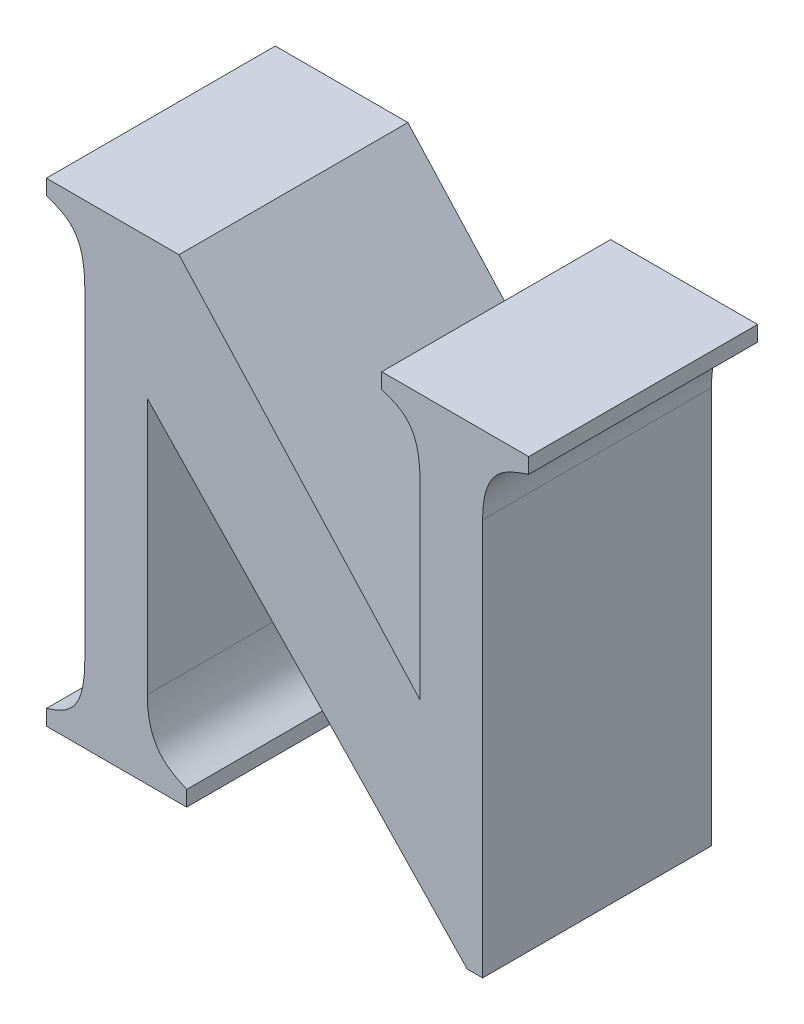
ISO-10303-21;
HEADER;
FILE_DESCRIPTION(('STEP AP214'),'2;1');
FILE_NAME('part.step','',(''),(''),'','','');
FILE_SCHEMA(('AUTOMOTIVE_DESIGN { 1 0 10303 214 1 1 1 1 }'));
ENDSEC;
DATA;
#1=APPLICATION_CONTEXT('core data for automotive mechanical design processes');
#2=APPLICATION_PROTOCOL_DEFINITION('international standard','automotive_design',2000,#1);
#3=PRODUCT_CONTEXT('',#1,'mechanical');
#4=PRODUCT('Part','Part','',(#3));
#5=PRODUCT_RELATED_PRODUCT_CATEGORY('part','',(#4));
#6=PRODUCT_DEFINITION_FORMATION('','',#4);
#7=PRODUCT_DEFINITION_CONTEXT('part definition',#1,'design');
#8=PRODUCT_DEFINITION('design','',#6,#7);
#9=PRODUCT_DEFINITION_SHAPE('','',#8);
#10=(LENGTH_UNIT() NAMED_UNIT(*) SI_UNIT(.MILLI.,.METRE.));
#11=(NAMED_UNIT(*) PLANE_ANGLE_UNIT() SI_UNIT($,.RADIAN.));
#12=(NAMED_UNIT(*) SI_UNIT($,.STERADIAN.) SOLID_ANGLE_UNIT());
#13=UNCERTAINTY_MEASURE_WITH_UNIT(LENGTH_MEASURE(1.E-05),#10,'distance_accuracy_value','');
#14=(GEOMETRIC_REPRESENTATION_CONTEXT(3) GLOBAL_UNCERTAINTY_ASSIGNED_CONTEXT((#13)) GLOBAL_UNIT_ASSIGNED_CONTEXT((#10,
#11,#12)) REPRESENTATION_CONTEXT('',''));
#15=CARTESIAN_POINT('',(0.,0.,0.));
#16=DIRECTION('',(0.,0.,1.));
#17=DIRECTION('',(1.,0.,0.));
#18=AXIS2_PLACEMENT_3D('',#15,#16,#17);
#19=CARTESIAN_POINT('',(1.131361356651,-0.46057454398,0.));
#20=DIRECTION('',(1.,0.,0.));
#21=DIRECTION('',(0.,1.,0.));
#22=AXIS2_PLACEMENT_3D('',#19,#20,#21);
#23=PLANE('',#22);
#24=DIRECTION('',(0.,-1.,0.));
#25=VECTOR('',#24,1.);
#26=CARTESIAN_POINT('',(1.131361356651,-0.28723157278345,0.));
#27=LINE('',#26,#25);
#28=CARTESIAN_POINT('',(1.131361356651,-0.28723157278345,0.));
#29=VERTEX_POINT('',#28);
#30=CARTESIAN_POINT('',(1.131361356651,-0.46057454398,0.));
#31=VERTEX_POINT('',#30);
#32=EDGE_CURVE('E11',#29,#31,#27,.T.);
#33=ORIENTED_EDGE('',*,*,#32,.F.);
#34=DIRECTION('',(0.,0.,1.));
#35=VECTOR('',#34,1.);
#36=CARTESIAN_POINT('',(1.131361356651,-0.28723157278345,0.));
#37=LINE('',#36,#35);
#38=CARTESIAN_POINT('',(1.131361356651,-0.28723157278345,0.1));
#39=VERTEX_POINT('',#38);
#40=EDGE_CURVE('E24',#29,#39,#37,.T.);
#41=ORIENTED_EDGE('',*,*,#40,.T.);
#42=DIRECTION('',(0.,1.,0.));
#43=VECTOR('',#42,1.);
#44=CARTESIAN_POINT('',(1.131361356651,-0.28723157278345,0.1));
#45=LINE('',#44,#43);
#46=CARTESIAN_POINT('',(1.131361356651,-0.46057454398,0.1));
#47=VERTEX_POINT('',#46);
#48=EDGE_CURVE('E172',#47,#39,#45,.T.);
#49=ORIENTED_EDGE('',*,*,#48,.F.);
#50=DIRECTION('',(0.,0.,1.));
#51=VECTOR('',#50,1.);
#52=CARTESIAN_POINT('',(1.131361356651,-0.46057454398,0.));
#53=LINE('',#52,#51);
#54=EDGE_CURVE('E359',#31,#47,#53,.T.);
#55=ORIENTED_EDGE('',*,*,#54,.F.);
#56=EDGE_LOOP('',(#33,#41,#49,#55));
#57=FACE_BOUND('',#56,.T.);
#58=ADVANCED_FACE('F17',(#57),#23,.T.);
#59=CARTESIAN_POINT('',(1.12464608155,-0.46057454398,0.));
#60=DIRECTION('',(0.,-1.,0.));
#61=DIRECTION('',(1.,0.,0.));
#62=AXIS2_PLACEMENT_3D('',#59,#60,#61);
#63=PLANE('',#62);
#64=DIRECTION('',(-1.,0.,0.));
#65=VECTOR('',#64,1.);
#66=CARTESIAN_POINT('',(1.131361356651,-0.46057454398,0.));
#67=LINE('',#66,#65);
#68=CARTESIAN_POINT('',(1.12464608155,-0.46057454398,0.));
#69=VERTEX_POINT('',#68);
#70=EDGE_CURVE('E357',#31,#69,#67,.T.);
#71=ORIENTED_EDGE('',*,*,#70,.F.);
#72=ORIENTED_EDGE('',*,*,#54,.T.);
#73=DIRECTION('',(1.,0.,0.));
#74=VECTOR('',#73,1.);
#75=CARTESIAN_POINT('',(1.131361356651,-0.46057454398,0.1));
#76=LINE('',#75,#74);
#77=CARTESIAN_POINT('',(1.12464608155,-0.46057454398,0.1));
#78=VERTEX_POINT('',#77);
#79=EDGE_CURVE('E355',#78,#47,#76,.T.);
#80=ORIENTED_EDGE('',*,*,#79,.F.);
#81=DIRECTION('',(0.,0.,1.));
#82=VECTOR('',#81,1.);
#83=CARTESIAN_POINT('',(1.12464608155,-0.46057454398,0.));
#84=LINE('',#83,#82);
#85=EDGE_CURVE('E352',#69,#78,#84,.T.);
#86=ORIENTED_EDGE('',*,*,#85,.F.);
#87=EDGE_LOOP('',(#71,#72,#80,#86));
#88=FACE_BOUND('',#87,.T.);
#89=ADVANCED_FACE('F429',(#88),#63,.T.);
#90=CARTESIAN_POINT('',(0.984879953778,-0.314513114854,0.));
#91=DIRECTION('',(-0.722505463033565,-0.691365211654921,0.));
#92=DIRECTION('',(0.691365211654921,-0.722505463033565,0.));
#93=AXIS2_PLACEMENT_3D('',#90,#91,#92);
#94=PLANE('',#93);
#95=DIRECTION('',(-0.691365211654921,0.722505463033565,0.));
#96=VECTOR('',#95,1.);
#97=CARTESIAN_POINT('',(1.12464608155,-0.46057454398,0.));
#98=LINE('',#97,#96);
#99=CARTESIAN_POINT('',(0.984879953778,-0.314513114854,0.));
#100=VERTEX_POINT('',#99);
#101=EDGE_CURVE('E350',#69,#100,#98,.T.);
#102=ORIENTED_EDGE('',*,*,#101,.F.);
#103=ORIENTED_EDGE('',*,*,#85,.T.);
#104=DIRECTION('',(0.691365211654921,-0.722505463033565,0.));
#105=VECTOR('',#104,1.);
#106=CARTESIAN_POINT('',(1.12464608155,-0.46057454398,0.1));
#107=LINE('',#106,#105);
#108=CARTESIAN_POINT('',(0.984879953778,-0.314513114854,0.1));
#109=VERTEX_POINT('',#108);
#110=EDGE_CURVE('E347',#109,#78,#107,.T.);
#111=ORIENTED_EDGE('',*,*,#110,.F.);
#112=DIRECTION('',(0.,0.,1.));
#113=VECTOR('',#112,1.);
#114=CARTESIAN_POINT('',(0.984879953778,-0.314513114854,0.));
#115=LINE('',#114,#113);
#116=EDGE_CURVE('E344',#100,#109,#115,.T.);
#117=ORIENTED_EDGE('',*,*,#116,.F.);
#118=EDGE_LOOP('',(#102,#103,#111,#117));
#119=FACE_BOUND('',#118,.T.);
#120=ADVANCED_FACE('F425',(#119),#94,.T.);
#121=CARTESIAN_POINT('',(0.984879953778,-0.426577508445,0.));
#122=DIRECTION('',(1.,0.,0.));
#123=DIRECTION('',(0.,1.,0.));
#124=AXIS2_PLACEMENT_3D('',#121,#122,#123);
#125=PLANE('',#124);
#126=DIRECTION('',(0.,-1.,0.));
#127=VECTOR('',#126,1.);
#128=CARTESIAN_POINT('',(0.984879953778,-0.314513114854,0.));
#129=LINE('',#128,#127);
#130=CARTESIAN_POINT('',(0.984879953778,-0.426577508445,0.));
#131=VERTEX_POINT('',#130);
#132=EDGE_CURVE('E342',#100,#131,#129,.T.);
#133=ORIENTED_EDGE('',*,*,#132,.F.);
#134=ORIENTED_EDGE('',*,*,#116,.T.);
#135=DIRECTION('',(0.,1.,0.));
#136=VECTOR('',#135,1.);
#137=CARTESIAN_POINT('',(0.984879953778,-0.314513114854,0.1));
#138=LINE('',#137,#136);
#139=CARTESIAN_POINT('',(0.984879953778,-0.426577508445,0.1));
#140=VERTEX_POINT('',#139);
#141=EDGE_CURVE('E339',#140,#109,#138,.T.);
#142=ORIENTED_EDGE('',*,*,#141,.F.);
#143=DIRECTION('',(0.,0.,1.));
#144=VECTOR('',#143,1.);
#145=CARTESIAN_POINT('',(0.984879953778,-0.426577508445,0.));
#146=LINE('',#145,#144);
#147=EDGE_CURVE('E333',#131,#140,#146,.T.);
#148=ORIENTED_EDGE('',*,*,#147,.F.);
#149=EDGE_LOOP('',(#133,#134,#142,#148));
#150=FACE_BOUND('',#149,.T.);
#151=ADVANCED_FACE('F421',(#150),#125,.T.);
#152=CARTESIAN_POINT('',(1.002089113507,-0.453859050516,0.));
#153=CARTESIAN_POINT('',(1.002089113507,-0.453859050516,0.1));
#154=CARTESIAN_POINT('',(0.995373838406,-0.450501256992,0.));
#155=CARTESIAN_POINT('',(0.995373838406,-0.450501256992,0.1));
#156=CARTESIAN_POINT('',(0.984879953778001,-0.447143557053,0.));
#157=CARTESIAN_POINT('',(0.984879953778001,-0.447143557053,0.1));
#158=CARTESIAN_POINT('',(0.984879953778,-0.426577508445,0.));
#159=CARTESIAN_POINT('',(0.984879953778,-0.426577508445,0.1));
#160=B_SPLINE_SURFACE_WITH_KNOTS('',3,1,((#152,#153),(#154,#155),(#156,#157),(#158,#159)),
.UNSPECIFIED.,.F.,.F.,.F.,(4,4),(2,2),(-1.,0.),(0.,0.01),.UNSPECIFIED.);
#161=CARTESIAN_POINT('',(0.984879953778,-0.426577508445,0.));
#162=CARTESIAN_POINT('',(0.984879953778001,-0.447143557053,0.));
#163=CARTESIAN_POINT('',(0.995373838406,-0.450501256992,0.));
#164=CARTESIAN_POINT('',(1.002089113507,-0.453859050516,0.));
#165=B_SPLINE_CURVE_WITH_KNOTS('',3,(#161,#162,#163,#164),.UNSPECIFIED.,.F.,.F.,(4,4),(0.,1.),.UNSPECIFIED.);
#166=CARTESIAN_POINT('',(1.002089113507,-0.453859050516,0.));
#167=VERTEX_POINT('',#166);
#168=EDGE_CURVE('E326',#131,#167,#165,.T.);
#169=CARTESIAN_POINT('',(1.002089113507,-0.453859050516,0.1));
#170=CARTESIAN_POINT('',(0.995373838406,-0.450501256992,0.1));
#171=CARTESIAN_POINT('',(0.984879953778001,-0.447143557053,0.1));
#172=CARTESIAN_POINT('',(0.984879953778,-0.426577508445,0.1));
#173=B_SPLINE_CURVE_WITH_KNOTS('',3,(#169,#170,#171,#172),.UNSPECIFIED.,.F.,.F.,(4,4),(-1.,0.),.UNSPECIFIED.);
#174=CARTESIAN_POINT('',(1.002089113507,-0.453859050516,0.1));
#175=VERTEX_POINT('',#174);
#176=EDGE_CURVE('E321',#175,#140,#173,.T.);
#177=DIRECTION('',(0.,0.,1.));
#178=VECTOR('',#177,1.);
#179=CARTESIAN_POINT('',(1.002089113507,-0.453859050516,0.));
#180=LINE('',#179,#178);
#181=EDGE_CURVE('E318',#167,#175,#180,.T.);
#182=ORIENTED_EDGE('',*,*,#168,.F.);
#183=ORIENTED_EDGE('',*,*,#147,.T.);
#184=ORIENTED_EDGE('',*,*,#176,.F.);
#185=ORIENTED_EDGE('',*,*,#181,.F.);
#186=EDGE_LOOP('',(#182,#183,#184,#185));
#187=FACE_BOUND('',#186,.T.);
#188=ADVANCED_FACE('F417',(#187),#160,.T.);
#189=CARTESIAN_POINT('',(1.002089113507,-0.46057454398,0.));
#190=DIRECTION('',(1.,0.,0.));
#191=DIRECTION('',(0.,1.,0.));
#192=AXIS2_PLACEMENT_3D('',#189,#190,#191);
#193=PLANE('',#192);
#194=DIRECTION('',(0.,-1.,0.));
#195=VECTOR('',#194,1.);
#196=CARTESIAN_POINT('',(1.002089113507,-0.453859050516,0.));
#197=LINE('',#196,#195);
#198=CARTESIAN_POINT('',(1.002089113507,-0.46057454398,0.));
#199=VERTEX_POINT('',#198);
#200=EDGE_CURVE('E316',#167,#199,#197,.T.);
#201=ORIENTED_EDGE('',*,*,#200,.F.);
#202=ORIENTED_EDGE('',*,*,#181,.T.);
#203=DIRECTION('',(0.,1.,0.));
#204=VECTOR('',#203,1.);
#205=CARTESIAN_POINT('',(1.002089113507,-0.453859050516,0.1));
#206=LINE('',#205,#204);
#207=CARTESIAN_POINT('',(1.002089113507,-0.46057454398,0.1));
#208=VERTEX_POINT('',#207);
#209=EDGE_CURVE('E313',#208,#175,#206,.T.);
#210=ORIENTED_EDGE('',*,*,#209,.F.);
#211=DIRECTION('',(0.,0.,1.));
#212=VECTOR('',#211,1.);
#213=CARTESIAN_POINT('',(1.002089113507,-0.46057454398,0.));
#214=LINE('',#213,#212);
#215=EDGE_CURVE('E310',#199,#208,#214,.T.);
#216=ORIENTED_EDGE('',*,*,#215,.F.);
#217=EDGE_LOOP('',(#201,#202,#210,#216));
#218=FACE_BOUND('',#217,.T.);
#219=ADVANCED_FACE('F413',(#218),#193,.T.);
#220=CARTESIAN_POINT('',(0.940809381699,-0.46057454398,0.));
#221=DIRECTION('',(0.,-1.,0.));
#222=DIRECTION('',(1.,0.,0.));
#223=AXIS2_PLACEMENT_3D('',#220,#221,#222);
#224=PLANE('',#223);
#225=DIRECTION('',(-1.,0.,0.));
#226=VECTOR('',#225,1.);
#227=CARTESIAN_POINT('',(1.002089113507,-0.46057454398,0.));
#228=LINE('',#227,#226);
#229=CARTESIAN_POINT('',(0.940809381699,-0.46057454398,0.));
#230=VERTEX_POINT('',#229);
#231=EDGE_CURVE('E308',#199,#230,#228,.T.);
#232=ORIENTED_EDGE('',*,*,#231,.F.);
#233=ORIENTED_EDGE('',*,*,#215,.T.);
#234=DIRECTION('',(1.,0.,0.));
#235=VECTOR('',#234,1.);
#236=CARTESIAN_POINT('',(1.002089113507,-0.46057454398,0.1));
#237=LINE('',#236,#235);
#238=CARTESIAN_POINT('',(0.940809381699,-0.46057454398,0.1));
#239=VERTEX_POINT('',#238);
#240=EDGE_CURVE('E305',#239,#208,#237,.T.);
#241=ORIENTED_EDGE('',*,*,#240,.F.);
#242=DIRECTION('',(0.,0.,1.));
#243=VECTOR('',#242,1.);
#244=CARTESIAN_POINT('',(0.940809381699,-0.46057454398,0.));
#245=LINE('',#244,#243);
#246=EDGE_CURVE('E302',#230,#239,#245,.T.);
#247=ORIENTED_EDGE('',*,*,#246,.F.);
#248=EDGE_LOOP('',(#232,#233,#241,#247));
#249=FACE_BOUND('',#248,.T.);
#250=ADVANCED_FACE('F409',(#249),#224,.T.);
#251=CARTESIAN_POINT('',(0.940809381699,-0.453859050516,0.));
#252=DIRECTION('',(-1.,0.,0.));
#253=DIRECTION('',(0.,-1.,0.));
#254=AXIS2_PLACEMENT_3D('',#251,#252,#253);
#255=PLANE('',#254);
#256=DIRECTION('',(0.,1.,0.));
#257=VECTOR('',#256,1.);
#258=CARTESIAN_POINT('',(0.940809381699,-0.46057454398,0.));
#259=LINE('',#258,#257);
#260=CARTESIAN_POINT('',(0.940809381699,-0.453859050516,0.));
#261=VERTEX_POINT('',#260);
#262=EDGE_CURVE('E300',#230,#261,#259,.T.);
#263=ORIENTED_EDGE('',*,*,#262,.F.);
#264=ORIENTED_EDGE('',*,*,#246,.T.);
#265=DIRECTION('',(0.,-1.,0.));
#266=VECTOR('',#265,1.);
#267=CARTESIAN_POINT('',(0.940809381699,-0.46057454398,0.1));
#268=LINE('',#267,#266);
#269=CARTESIAN_POINT('',(0.940809381699,-0.453859050516,0.1));
#270=VERTEX_POINT('',#269);
#271=EDGE_CURVE('E297',#270,#239,#268,.T.);
#272=ORIENTED_EDGE('',*,*,#271,.F.);
#273=DIRECTION('',(0.,0.,1.));
#274=VECTOR('',#273,1.);
#275=CARTESIAN_POINT('',(0.940809381699,-0.453859050516,0.));
#276=LINE('',#275,#274);
#277=EDGE_CURVE('E291',#261,#270,#276,.T.);
#278=ORIENTED_EDGE('',*,*,#277,.F.);
#279=EDGE_LOOP('',(#263,#264,#272,#278));
#280=FACE_BOUND('',#279,.T.);
#281=ADVANCED_FACE('F405',(#280),#255,.T.);
#282=CARTESIAN_POINT('',(0.957598349318,-0.426577508445,0.));
#283=CARTESIAN_POINT('',(0.957598349318,-0.426577508445,0.1));
#284=CARTESIAN_POINT('',(0.957598349318001,-0.447143557053,0.));
#285=CARTESIAN_POINT('',(0.957598349318001,-0.447143557053,0.1));
#286=CARTESIAN_POINT('',(0.950883074217001,-0.450501256992,0.));
#287=CARTESIAN_POINT('',(0.950883074217001,-0.450501256992,0.1));
#288=CARTESIAN_POINT('',(0.940809381699,-0.453859050516,0.));
#289=CARTESIAN_POINT('',(0.940809381699,-0.453859050516,0.1));
#290=B_SPLINE_SURFACE_WITH_KNOTS('',3,1,((#282,#283),(#284,#285),(#286,#287),(#288,#289)),
.UNSPECIFIED.,.F.,.F.,.F.,(4,4),(2,2),(-1.,0.),(0.,0.01),.UNSPECIFIED.);
#291=CARTESIAN_POINT('',(0.940809381699,-0.453859050516,0.));
#292=CARTESIAN_POINT('',(0.950883074217001,-0.450501256992,0.));
#293=CARTESIAN_POINT('',(0.957598349318001,-0.447143557053,0.));
#294=CARTESIAN_POINT('',(0.957598349318,-0.426577508445,0.));
#295=B_SPLINE_CURVE_WITH_KNOTS('',3,(#291,#292,#293,#294),.UNSPECIFIED.,.F.,.F.,(4,4),(0.,1.),.UNSPECIFIED.);
#296=CARTESIAN_POINT('',(0.957598349318,-0.426577508445,0.));
#297=VERTEX_POINT('',#296);
#298=EDGE_CURVE('E284',#261,#297,#295,.T.);
#299=CARTESIAN_POINT('',(0.957598349318,-0.426577508445,0.1));
#300=CARTESIAN_POINT('',(0.957598349318001,-0.447143557053,0.1));
#301=CARTESIAN_POINT('',(0.950883074217001,-0.450501256992,0.1));
#302=CARTESIAN_POINT('',(0.940809381699,-0.453859050516,0.1));
#303=B_SPLINE_CURVE_WITH_KNOTS('',3,(#299,#300,#301,#302),.UNSPECIFIED.,.F.,.F.,(4,4),(-1.,0.),.UNSPECIFIED.);
#304=CARTESIAN_POINT('',(0.957598349318,-0.426577508445,0.1));
#305=VERTEX_POINT('',#304);
#306=EDGE_CURVE('E279',#305,#270,#303,.T.);
#307=DIRECTION('',(0.,0.,1.));
#308=VECTOR('',#307,1.);
#309=CARTESIAN_POINT('',(0.957598349318,-0.426577508445,0.));
#310=LINE('',#309,#308);
#311=EDGE_CURVE('E276',#297,#305,#310,.T.);
#312=ORIENTED_EDGE('',*,*,#298,.F.);
#313=ORIENTED_EDGE('',*,*,#277,.T.);
#314=ORIENTED_EDGE('',*,*,#306,.F.);
#315=ORIENTED_EDGE('',*,*,#311,.F.);
#316=EDGE_LOOP('',(#312,#313,#314,#315));
#317=FACE_BOUND('',#316,.T.);
#318=ADVANCED_FACE('F401',(#317),#290,.T.);
#319=CARTESIAN_POINT('',(0.957598349318,-0.28723157278345,0.));
#320=DIRECTION('',(-1.,0.,0.));
#321=DIRECTION('',(0.,-1.,0.));
#322=AXIS2_PLACEMENT_3D('',#319,#320,#321);
#323=PLANE('',#322);
#324=DIRECTION('',(0.,1.,0.));
#325=VECTOR('',#324,1.);
#326=CARTESIAN_POINT('',(0.957598349318,-0.426577508445,0.));
#327=LINE('',#326,#325);
#328=CARTESIAN_POINT('',(0.957598349318,-0.28723157278345,0.));
#329=VERTEX_POINT('',#328);
#330=EDGE_CURVE('E274',#297,#329,#327,.T.);
#331=ORIENTED_EDGE('',*,*,#330,.F.);
#332=ORIENTED_EDGE('',*,*,#311,.T.);
#333=DIRECTION('',(0.,-1.,0.));
#334=VECTOR('',#333,1.);
#335=CARTESIAN_POINT('',(0.957598349318,-0.426577508445,0.1));
#336=LINE('',#335,#334);
#337=CARTESIAN_POINT('',(0.957598349318,-0.28723157278345,0.1));
#338=VERTEX_POINT('',#337);
#339=EDGE_CURVE('E271',#338,#305,#336,.T.);
#340=ORIENTED_EDGE('',*,*,#339,.F.);
#341=DIRECTION('',(0.,0.,1.));
#342=VECTOR('',#341,1.);
#343=CARTESIAN_POINT('',(0.957598349318,-0.28723157278345,0.));
#344=LINE('',#343,#342);
#345=EDGE_CURVE('E265',#329,#338,#344,.T.);
#346=ORIENTED_EDGE('',*,*,#345,.F.);
#347=EDGE_LOOP('',(#331,#332,#340,#346));
#348=FACE_BOUND('',#347,.T.);
#349=ADVANCED_FACE('F397',(#348),#323,.T.);
#350=CARTESIAN_POINT('',(0.940809381699,-0.25995003071244,0.));
#351=CARTESIAN_POINT('',(0.940809381699,-0.25995003071244,0.1));
#352=CARTESIAN_POINT('',(0.950883074217,-0.26330769945751,0.));
#353=CARTESIAN_POINT('',(0.950883074217,-0.26330769945751,0.1));
#354=CARTESIAN_POINT('',(0.957598349318,-0.26666549298124,0.));
#355=CARTESIAN_POINT('',(0.957598349318,-0.26666549298124,0.1));
#356=CARTESIAN_POINT('',(0.957598349318,-0.28723157278345,0.));
#357=CARTESIAN_POINT('',(0.957598349318,-0.28723157278345,0.1));
#358=B_SPLINE_SURFACE_WITH_KNOTS('',3,1,((#350,#351),(#352,#353),(#354,#355),(#356,#357)),
.UNSPECIFIED.,.F.,.F.,.F.,(4,4),(2,2),(-1.,0.),(0.,0.01),.UNSPECIFIED.);
#359=CARTESIAN_POINT('',(0.957598349318,-0.28723157278345,0.));
#360=CARTESIAN_POINT('',(0.957598349318,-0.26666549298124,0.));
#361=CARTESIAN_POINT('',(0.950883074217,-0.26330769945751,0.));
#362=CARTESIAN_POINT('',(0.940809381699,-0.25995003071244,0.));
#363=B_SPLINE_CURVE_WITH_KNOTS('',3,(#359,#360,#361,#362),.UNSPECIFIED.,.F.,.F.,(4,4),(0.,1.),.UNSPECIFIED.);
#364=CARTESIAN_POINT('',(0.940809381699,-0.25995003071244,0.));
#365=VERTEX_POINT('',#364);
#366=EDGE_CURVE('E258',#329,#365,#363,.T.);
#367=CARTESIAN_POINT('',(0.940809381699,-0.25995003071244,0.1));
#368=CARTESIAN_POINT('',(0.950883074217,-0.26330769945751,0.1));
#369=CARTESIAN_POINT('',(0.957598349318,-0.26666549298124,0.1));
#370=CARTESIAN_POINT('',(0.957598349318,-0.28723157278345,0.1));
#371=B_SPLINE_CURVE_WITH_KNOTS('',3,(#367,#368,#369,#370),.UNSPECIFIED.,.F.,.F.,(4,4),(-1.,0.),.UNSPECIFIED.);
#372=CARTESIAN_POINT('',(0.940809381699,-0.25995003071244,0.1));
#373=VERTEX_POINT('',#372);
#374=EDGE_CURVE('E253',#373,#338,#371,.T.);
#375=DIRECTION('',(0.,0.,1.));
#376=VECTOR('',#375,1.);
#377=CARTESIAN_POINT('',(0.940809381699,-0.25995003071244,0.));
#378=LINE('',#377,#376);
#379=EDGE_CURVE('E250',#365,#373,#378,.T.);
#380=ORIENTED_EDGE('',*,*,#366,.F.);
#381=ORIENTED_EDGE('',*,*,#345,.T.);
#382=ORIENTED_EDGE('',*,*,#374,.F.);
#383=ORIENTED_EDGE('',*,*,#379,.F.);
#384=EDGE_LOOP('',(#380,#381,#382,#383));
#385=FACE_BOUND('',#384,.T.);
#386=ADVANCED_FACE('F393',(#385),#358,.T.);
#387=CARTESIAN_POINT('',(0.940809381699,-0.25323453724898,0.));
#388=DIRECTION('',(-1.,0.,0.));
#389=DIRECTION('',(0.,-1.,0.));
#390=AXIS2_PLACEMENT_3D('',#387,#388,#389);
#391=PLANE('',#390);
#392=DIRECTION('',(0.,1.,0.));
#393=VECTOR('',#392,1.);
#394=CARTESIAN_POINT('',(0.940809381699,-0.25995003071244,0.));
#395=LINE('',#394,#393);
#396=CARTESIAN_POINT('',(0.940809381699,-0.25323453724898,0.));
#397=VERTEX_POINT('',#396);
#398=EDGE_CURVE('E248',#365,#397,#395,.T.);
#399=ORIENTED_EDGE('',*,*,#398,.F.);
#400=ORIENTED_EDGE('',*,*,#379,.T.);
#401=DIRECTION('',(0.,-1.,0.));
#402=VECTOR('',#401,1.);
#403=CARTESIAN_POINT('',(0.940809381699,-0.25995003071244,0.1));
#404=LINE('',#403,#402);
#405=CARTESIAN_POINT('',(0.940809381699,-0.25323453724898,0.1));
#406=VERTEX_POINT('',#405);
#407=EDGE_CURVE('E245',#406,#373,#404,.T.);
#408=ORIENTED_EDGE('',*,*,#407,.F.);
#409=DIRECTION('',(0.,0.,1.));
#410=VECTOR('',#409,1.);
#411=CARTESIAN_POINT('',(0.940809381699,-0.25323453724898,0.));
#412=LINE('',#411,#410);
#413=EDGE_CURVE('E242',#397,#406,#412,.T.);
#414=ORIENTED_EDGE('',*,*,#413,.F.);
#415=EDGE_LOOP('',(#399,#400,#408,#414));
#416=FACE_BOUND('',#415,.T.);
#417=ADVANCED_FACE('F389',(#416),#391,.T.);
#418=CARTESIAN_POINT('',(0.99873069609,-0.25323453724898,0.));
#419=DIRECTION('',(0.,1.,0.));
#420=DIRECTION('',(-1.,0.,0.));
#421=AXIS2_PLACEMENT_3D('',#418,#419,#420);
#422=PLANE('',#421);
#423=DIRECTION('',(1.,0.,0.));
#424=VECTOR('',#423,1.);
#425=CARTESIAN_POINT('',(0.940809381699,-0.25323453724898,0.));
#426=LINE('',#425,#424);
#427=CARTESIAN_POINT('',(0.99873069609,-0.25323453724898,0.));
#428=VERTEX_POINT('',#427);
#429=EDGE_CURVE('E240',#397,#428,#426,.T.);
#430=ORIENTED_EDGE('',*,*,#429,.F.);
#431=ORIENTED_EDGE('',*,*,#413,.T.);
#432=DIRECTION('',(-1.,0.,0.));
#433=VECTOR('',#432,1.);
#434=CARTESIAN_POINT('',(0.940809381699,-0.25323453724898,0.1));
#435=LINE('',#434,#433);
#436=CARTESIAN_POINT('',(0.99873069609,-0.25323453724898,0.1));
#437=VERTEX_POINT('',#436);
#438=EDGE_CURVE('E237',#437,#406,#435,.T.);
#439=ORIENTED_EDGE('',*,*,#438,.F.);
#440=DIRECTION('',(0.,0.,1.));
#441=VECTOR('',#440,1.);
#442=CARTESIAN_POINT('',(0.99873069609,-0.25323453724898,0.));
#443=LINE('',#442,#441);
#444=EDGE_CURVE('E234',#428,#437,#443,.T.);
#445=ORIENTED_EDGE('',*,*,#444,.F.);
#446=EDGE_LOOP('',(#430,#431,#439,#445));
#447=FACE_BOUND('',#446,.T.);
#448=ADVANCED_FACE('F385',(#447),#422,.T.);
#449=CARTESIAN_POINT('',(1.104079752191,-0.369076323775,0.));
#450=DIRECTION('',(0.73981818348661,0.672806848495593,0.));
#451=DIRECTION('',(-0.672806848495593,0.73981818348661,0.));
#452=AXIS2_PLACEMENT_3D('',#449,#450,#451);
#453=PLANE('',#452);
#454=DIRECTION('',(0.672806848495593,-0.73981818348661,0.));
#455=VECTOR('',#454,1.);
#456=CARTESIAN_POINT('',(0.99873069609,-0.25323453724898,0.));
#457=LINE('',#456,#455);
#458=CARTESIAN_POINT('',(1.104079752191,-0.369076323775,0.));
#459=VERTEX_POINT('',#458);
#460=EDGE_CURVE('E232',#428,#459,#457,.T.);
#461=ORIENTED_EDGE('',*,*,#460,.F.);
#462=ORIENTED_EDGE('',*,*,#444,.T.);
#463=DIRECTION('',(-0.672806848495593,0.73981818348661,0.));
#464=VECTOR('',#463,1.);
#465=CARTESIAN_POINT('',(0.99873069609,-0.25323453724898,0.1));
#466=LINE('',#465,#464);
#467=CARTESIAN_POINT('',(1.104079752191,-0.369076323775,0.1));
#468=VERTEX_POINT('',#467);
#469=EDGE_CURVE('E229',#468,#437,#466,.T.);
#470=ORIENTED_EDGE('',*,*,#469,.F.);
#471=DIRECTION('',(0.,0.,1.));
#472=VECTOR('',#471,1.);
#473=CARTESIAN_POINT('',(1.104079752191,-0.369076323775,0.));
#474=LINE('',#473,#472);
#475=EDGE_CURVE('E226',#459,#468,#474,.T.);
#476=ORIENTED_EDGE('',*,*,#475,.F.);
#477=EDGE_LOOP('',(#461,#462,#470,#476));
#478=FACE_BOUND('',#477,.T.);
#479=ADVANCED_FACE('F381',(#478),#453,.T.);
#480=CARTESIAN_POINT('',(1.104079752191,-0.28723157278345,0.));
#481=DIRECTION('',(-1.,0.,0.));
#482=DIRECTION('',(0.,-1.,0.));
#483=AXIS2_PLACEMENT_3D('',#480,#481,#482);
#484=PLANE('',#483);
#485=DIRECTION('',(0.,1.,0.));
#486=VECTOR('',#485,1.);
#487=CARTESIAN_POINT('',(1.104079752191,-0.369076323775,0.));
#488=LINE('',#487,#486);
#489=CARTESIAN_POINT('',(1.104079752191,-0.28723157278345,0.));
#490=VERTEX_POINT('',#489);
#491=EDGE_CURVE('E224',#459,#490,#488,.T.);
#492=ORIENTED_EDGE('',*,*,#491,.F.);
#493=ORIENTED_EDGE('',*,*,#475,.T.);
#494=DIRECTION('',(0.,-1.,0.));
#495=VECTOR('',#494,1.);
#496=CARTESIAN_POINT('',(1.104079752191,-0.369076323775,0.1));
#497=LINE('',#496,#495);
#498=CARTESIAN_POINT('',(1.104079752191,-0.28723157278345,0.1));
#499=VERTEX_POINT('',#498);
#500=EDGE_CURVE('E221',#499,#468,#497,.T.);
#501=ORIENTED_EDGE('',*,*,#500,.F.);
#502=DIRECTION('',(0.,0.,1.));
#503=VECTOR('',#502,1.);
#504=CARTESIAN_POINT('',(1.104079752191,-0.28723157278345,0.));
#505=LINE('',#504,#503);
#506=EDGE_CURVE('E215',#490,#499,#505,.T.);
#507=ORIENTED_EDGE('',*,*,#506,.F.);
#508=EDGE_LOOP('',(#492,#493,#501,#507));
#509=FACE_BOUND('',#508,.T.);
#510=ADVANCED_FACE('F377',(#509),#484,.T.);
#511=CARTESIAN_POINT('',(1.087290784572,-0.25995003071244,0.));
#512=CARTESIAN_POINT('',(1.087290784572,-0.25995003071244,0.1));
#513=CARTESIAN_POINT('',(1.09736447709,-0.26330769945751,0.));
#514=CARTESIAN_POINT('',(1.09736447709,-0.26330769945751,0.1));
#515=CARTESIAN_POINT('',(1.104079752191,-0.26666549298124,0.));
#516=CARTESIAN_POINT('',(1.104079752191,-0.26666549298124,0.1));
#517=CARTESIAN_POINT('',(1.104079752191,-0.28723157278345,0.));
#518=CARTESIAN_POINT('',(1.104079752191,-0.28723157278345,0.1));
#519=B_SPLINE_SURFACE_WITH_KNOTS('',3,1,((#511,#512),(#513,#514),(#515,#516),(#517,#518)),
.UNSPECIFIED.,.F.,.F.,.F.,(4,4),(2,2),(-1.,0.),(0.,0.01),.UNSPECIFIED.);
#520=CARTESIAN_POINT('',(1.104079752191,-0.28723157278345,0.));
#521=CARTESIAN_POINT('',(1.104079752191,-0.26666549298124,0.));
#522=CARTESIAN_POINT('',(1.09736447709,-0.26330769945751,0.));
#523=CARTESIAN_POINT('',(1.087290784572,-0.25995003071244,0.));
#524=B_SPLINE_CURVE_WITH_KNOTS('',3,(#520,#521,#522,#523),.UNSPECIFIED.,.F.,.F.,(4,4),(0.,1.),.UNSPECIFIED.);
#525=CARTESIAN_POINT('',(1.087290784572,-0.25995003071244,0.));
#526=VERTEX_POINT('',#525);
#527=EDGE_CURVE('E208',#490,#526,#524,.T.);
#528=CARTESIAN_POINT('',(1.087290784572,-0.25995003071244,0.1));
#529=CARTESIAN_POINT('',(1.09736447709,-0.26330769945751,0.1));
#530=CARTESIAN_POINT('',(1.104079752191,-0.26666549298124,0.1));
#531=CARTESIAN_POINT('',(1.104079752191,-0.28723157278345,0.1));
#532=B_SPLINE_CURVE_WITH_KNOTS('',3,(#528,#529,#530,#531),.UNSPECIFIED.,.F.,.F.,(4,4),(-1.,0.),.UNSPECIFIED.);
#533=CARTESIAN_POINT('',(1.087290784572,-0.25995003071244,0.1));
#534=VERTEX_POINT('',#533);
#535=EDGE_CURVE('E203',#534,#499,#532,.T.);
#536=DIRECTION('',(0.,0.,1.));
#537=VECTOR('',#536,1.);
#538=CARTESIAN_POINT('',(1.087290784572,-0.25995003071244,0.));
#539=LINE('',#538,#537);
#540=EDGE_CURVE('E200',#526,#534,#539,.T.);
#541=ORIENTED_EDGE('',*,*,#527,.F.);
#542=ORIENTED_EDGE('',*,*,#506,.T.);
#543=ORIENTED_EDGE('',*,*,#535,.F.);
#544=ORIENTED_EDGE('',*,*,#540,.F.);
#545=EDGE_LOOP('',(#541,#542,#543,#544));
#546=FACE_BOUND('',#545,.T.);
#547=ADVANCED_FACE('F373',(#546),#519,.T.);
#548=CARTESIAN_POINT('',(1.087290784572,-0.25323453724898,0.));
#549=DIRECTION('',(-1.,0.,0.));
#550=DIRECTION('',(0.,-1.,0.));
#551=AXIS2_PLACEMENT_3D('',#548,#549,#550);
#552=PLANE('',#551);
#553=DIRECTION('',(0.,1.,0.));
#554=VECTOR('',#553,1.);
#555=CARTESIAN_POINT('',(1.087290784572,-0.25995003071244,0.));
#556=LINE('',#555,#554);
#557=CARTESIAN_POINT('',(1.087290784572,-0.25323453724898,0.));
#558=VERTEX_POINT('',#557);
#559=EDGE_CURVE('E198',#526,#558,#556,.T.);
#560=ORIENTED_EDGE('',*,*,#559,.F.);
#561=ORIENTED_EDGE('',*,*,#540,.T.);
#562=DIRECTION('',(0.,-1.,0.));
#563=VECTOR('',#562,1.);
#564=CARTESIAN_POINT('',(1.087290784572,-0.25995003071244,0.1));
#565=LINE('',#564,#563);
#566=CARTESIAN_POINT('',(1.087290784572,-0.25323453724898,0.1));
#567=VERTEX_POINT('',#566);
#568=EDGE_CURVE('E195',#567,#534,#565,.T.);
#569=ORIENTED_EDGE('',*,*,#568,.F.);
#570=DIRECTION('',(0.,0.,1.));
#571=VECTOR('',#570,1.);
#572=CARTESIAN_POINT('',(1.087290784572,-0.25323453724898,0.));
#573=LINE('',#572,#571);
#574=EDGE_CURVE('E192',#558,#567,#573,.T.);
#575=ORIENTED_EDGE('',*,*,#574,.F.);
#576=EDGE_LOOP('',(#560,#561,#569,#575));
#577=FACE_BOUND('',#576,.T.);
#578=ADVANCED_FACE('F369',(#577),#552,.T.);
#579=CARTESIAN_POINT('',(1.1515074939,-0.25323453724898,0.));
#580=DIRECTION('',(0.,1.,0.));
#581=DIRECTION('',(-1.,0.,0.));
#582=AXIS2_PLACEMENT_3D('',#579,#580,#581);
#583=PLANE('',#582);
#584=DIRECTION('',(1.,0.,0.));
#585=VECTOR('',#584,1.);
#586=CARTESIAN_POINT('',(1.087290784572,-0.25323453724898,0.));
#587=LINE('',#586,#585);
#588=CARTESIAN_POINT('',(1.1515074939,-0.25323453724898,0.));
#589=VERTEX_POINT('',#588);
#590=EDGE_CURVE('E190',#558,#589,#587,.T.);
#591=ORIENTED_EDGE('',*,*,#590,.F.);
#592=ORIENTED_EDGE('',*,*,#574,.T.);
#593=DIRECTION('',(-1.,0.,0.));
#594=VECTOR('',#593,1.);
#595=CARTESIAN_POINT('',(1.087290784572,-0.25323453724898,0.1));
#596=LINE('',#595,#594);
#597=CARTESIAN_POINT('',(1.1515074939,-0.25323453724898,0.1));
#598=VERTEX_POINT('',#597);
#599=EDGE_CURVE('E188',#598,#567,#596,.T.);
#600=ORIENTED_EDGE('',*,*,#599,.F.);
#601=DIRECTION('',(0.,0.,1.));
#602=VECTOR('',#601,1.);
#603=CARTESIAN_POINT('',(1.1515074939,-0.25323453724898,0.));
#604=LINE('',#603,#602);
#605=EDGE_CURVE('E157',#589,#598,#604,.T.);
#606=ORIENTED_EDGE('',*,*,#605,.F.);
#607=EDGE_LOOP('',(#591,#592,#600,#606));
#608=FACE_BOUND('',#607,.T.);
#609=ADVANCED_FACE('F367',(#608),#583,.T.);
#610=CARTESIAN_POINT('',(1.1515074939,-0.25995003071244,0.));
#611=DIRECTION('',(1.,0.,0.));
#612=DIRECTION('',(0.,1.,0.));
#613=AXIS2_PLACEMENT_3D('',#610,#611,#612);
#614=PLANE('',#613);
#615=DIRECTION('',(0.,-1.,0.));
#616=VECTOR('',#615,1.);
#617=CARTESIAN_POINT('',(1.1515074939,-0.25323453724898,0.));
#618=LINE('',#617,#616);
#619=CARTESIAN_POINT('',(1.1515074939,-0.25995003071244,0.));
#620=VERTEX_POINT('',#619);
#621=EDGE_CURVE('E161',#589,#620,#618,.T.);
#622=ORIENTED_EDGE('',*,*,#621,.F.);
#623=ORIENTED_EDGE('',*,*,#605,.T.);
#624=DIRECTION('',(0.,1.,0.));
#625=VECTOR('',#624,1.);
#626=CARTESIAN_POINT('',(1.1515074939,-0.25323453724898,0.1));
#627=LINE('',#626,#625);
#628=CARTESIAN_POINT('',(1.1515074939,-0.25995003071244,0.1));
#629=VERTEX_POINT('',#628);
#630=EDGE_CURVE('E150',#629,#598,#627,.T.);
#631=ORIENTED_EDGE('',*,*,#630,.F.);
#632=DIRECTION('',(0.,0.,1.));
#633=VECTOR('',#632,1.);
#634=CARTESIAN_POINT('',(1.1515074939,-0.25995003071244,0.));
#635=LINE('',#634,#633);
#636=EDGE_CURVE('E154',#620,#629,#635,.T.);
#637=ORIENTED_EDGE('',*,*,#636,.F.);
#638=EDGE_LOOP('',(#622,#623,#631,#637));
#639=FACE_BOUND('',#638,.T.);
#640=ADVANCED_FACE('F153',(#639),#614,.T.);
#641=CARTESIAN_POINT('',(1.131361356651,-0.28723157278345,0.));
#642=CARTESIAN_POINT('',(1.131361356651,-0.28723157278345,0.1));
#643=CARTESIAN_POINT('',(1.131361356651,-0.26666549298124,0.));
#644=CARTESIAN_POINT('',(1.131361356651,-0.26666549298124,0.1));
#645=CARTESIAN_POINT('',(1.141435049169,-0.26330769945751,0.));
#646=CARTESIAN_POINT('',(1.141435049169,-0.26330769945751,0.1));
#647=CARTESIAN_POINT('',(1.1515074939,-0.25995003071244,0.));
#648=CARTESIAN_POINT('',(1.1515074939,-0.25995003071244,0.1));
#649=B_SPLINE_SURFACE_WITH_KNOTS('',3,1,((#641,#642),(#643,#644),(#645,#646),(#647,#648)),
.UNSPECIFIED.,.F.,.F.,.F.,(4,4),(2,2),(-1.,0.),(0.,0.01),.UNSPECIFIED.);
#650=CARTESIAN_POINT('',(1.1515074939,-0.25995003071244,0.));
#651=CARTESIAN_POINT('',(1.141435049169,-0.26330769945751,0.));
#652=CARTESIAN_POINT('',(1.131361356651,-0.26666549298124,0.));
#653=CARTESIAN_POINT('',(1.131361356651,-0.28723157278345,0.));
#654=B_SPLINE_CURVE_WITH_KNOTS('',3,(#650,#651,#652,#653),.UNSPECIFIED.,.F.,.F.,(4,4),(0.,1.),.UNSPECIFIED.);
#655=EDGE_CURVE('E167',#620,#29,#654,.T.);
#656=CARTESIAN_POINT('',(1.131361356651,-0.28723157278345,0.1));
#657=CARTESIAN_POINT('',(1.131361356651,-0.26666549298124,0.1));
#658=CARTESIAN_POINT('',(1.141435049169,-0.26330769945751,0.1));
#659=CARTESIAN_POINT('',(1.1515074939,-0.25995003071244,0.1));
#660=B_SPLINE_CURVE_WITH_KNOTS('',3,(#656,#657,#658,#659),.UNSPECIFIED.,.F.,.F.,(4,4),(-1.,0.),.UNSPECIFIED.);
#661=EDGE_CURVE('E166',#39,#629,#660,.T.);
#662=ORIENTED_EDGE('',*,*,#655,.F.);
#663=ORIENTED_EDGE('',*,*,#636,.T.);
#664=ORIENTED_EDGE('',*,*,#661,.F.);
#665=ORIENTED_EDGE('',*,*,#40,.F.);
#666=EDGE_LOOP('',(#662,#663,#664,#665));
#667=FACE_BOUND('',#666,.T.);
#668=ADVANCED_FACE('F165',(#667),#649,.T.);
#669=CARTESIAN_POINT('',(1.042843798646,-0.350700839011321,0.));
#670=DIRECTION('',(0.,0.,1.));
#671=DIRECTION('',(1.,0.,0.));
#672=AXIS2_PLACEMENT_3D('',#669,#670,#671);
#673=PLANE('',#672);
#674=ORIENTED_EDGE('',*,*,#655,.T.);
#675=ORIENTED_EDGE('',*,*,#32,.T.);
#676=ORIENTED_EDGE('',*,*,#70,.T.);
#677=ORIENTED_EDGE('',*,*,#101,.T.);
#678=ORIENTED_EDGE('',*,*,#132,.T.);
#679=ORIENTED_EDGE('',*,*,#168,.T.);
#680=ORIENTED_EDGE('',*,*,#200,.T.);
#681=ORIENTED_EDGE('',*,*,#231,.T.);
#682=ORIENTED_EDGE('',*,*,#262,.T.);
#683=ORIENTED_EDGE('',*,*,#298,.T.);
#684=ORIENTED_EDGE('',*,*,#330,.T.);
#685=ORIENTED_EDGE('',*,*,#366,.T.);
#686=ORIENTED_EDGE('',*,*,#398,.T.);
#687=ORIENTED_EDGE('',*,*,#429,.T.);
#688=ORIENTED_EDGE('',*,*,#460,.T.);
#689=ORIENTED_EDGE('',*,*,#491,.T.);
#690=ORIENTED_EDGE('',*,*,#527,.T.);
#691=ORIENTED_EDGE('',*,*,#559,.T.);
#692=ORIENTED_EDGE('',*,*,#590,.T.);
#693=ORIENTED_EDGE('',*,*,#621,.T.);
#694=EDGE_LOOP('',(#674,#675,#676,#677,#678,#679,#680,#681,#682,#683,#684,#685,#686,#687,#688,
#689,#690,#691,#692,#693));
#695=FACE_BOUND('',#694,.T.);
#696=ADVANCED_FACE('F362',(#695),#673,.F.);
#697=CARTESIAN_POINT('',(1.042843798646,-0.350700839011321,0.1));
#698=DIRECTION('',(0.,0.,1.));
#699=DIRECTION('',(1.,0.,0.));
#700=AXIS2_PLACEMENT_3D('',#697,#698,#699);
#701=PLANE('',#700);
#702=ORIENTED_EDGE('',*,*,#661,.T.);
#703=ORIENTED_EDGE('',*,*,#630,.T.);
#704=ORIENTED_EDGE('',*,*,#599,.T.);
#705=ORIENTED_EDGE('',*,*,#568,.T.);
#706=ORIENTED_EDGE('',*,*,#535,.T.);
#707=ORIENTED_EDGE('',*,*,#500,.T.);
#708=ORIENTED_EDGE('',*,*,#469,.T.);
#709=ORIENTED_EDGE('',*,*,#438,.T.);
#710=ORIENTED_EDGE('',*,*,#407,.T.);
#711=ORIENTED_EDGE('',*,*,#374,.T.);
#712=ORIENTED_EDGE('',*,*,#339,.T.);
#713=ORIENTED_EDGE('',*,*,#306,.T.);
#714=ORIENTED_EDGE('',*,*,#271,.T.);
#715=ORIENTED_EDGE('',*,*,#240,.T.);
#716=ORIENTED_EDGE('',*,*,#209,.T.);
#717=ORIENTED_EDGE('',*,*,#176,.T.);
#718=ORIENTED_EDGE('',*,*,#141,.T.);
#719=ORIENTED_EDGE('',*,*,#110,.T.);
#720=ORIENTED_EDGE('',*,*,#79,.T.);
#721=ORIENTED_EDGE('',*,*,#48,.T.);
#722=EDGE_LOOP('',(#702,#703,#704,#705,#706,#707,#708,#709,#710,#711,#712,#713,#714,#715,#716,
#717,#718,#719,#720,#721));
#723=FACE_BOUND('',#722,.T.);
#724=ADVANCED_FACE('F170',(#723),#701,.T.);
#725=CLOSED_SHELL('',(#58,#89,#120,#151,#188,#219,#250,#281,#318,#349,#386,#417,#448,#479,#510,
#547,#578,#609,#640,#668,#696,#724));
#726=MANIFOLD_SOLID_BREP('B1',#725);
#727=ADVANCED_BREP_SHAPE_REPRESENTATION('',(#18,#726),#14);
#728=SHAPE_DEFINITION_REPRESENTATION(#9,#727);
ENDSEC;
END-ISO-10303-21;
